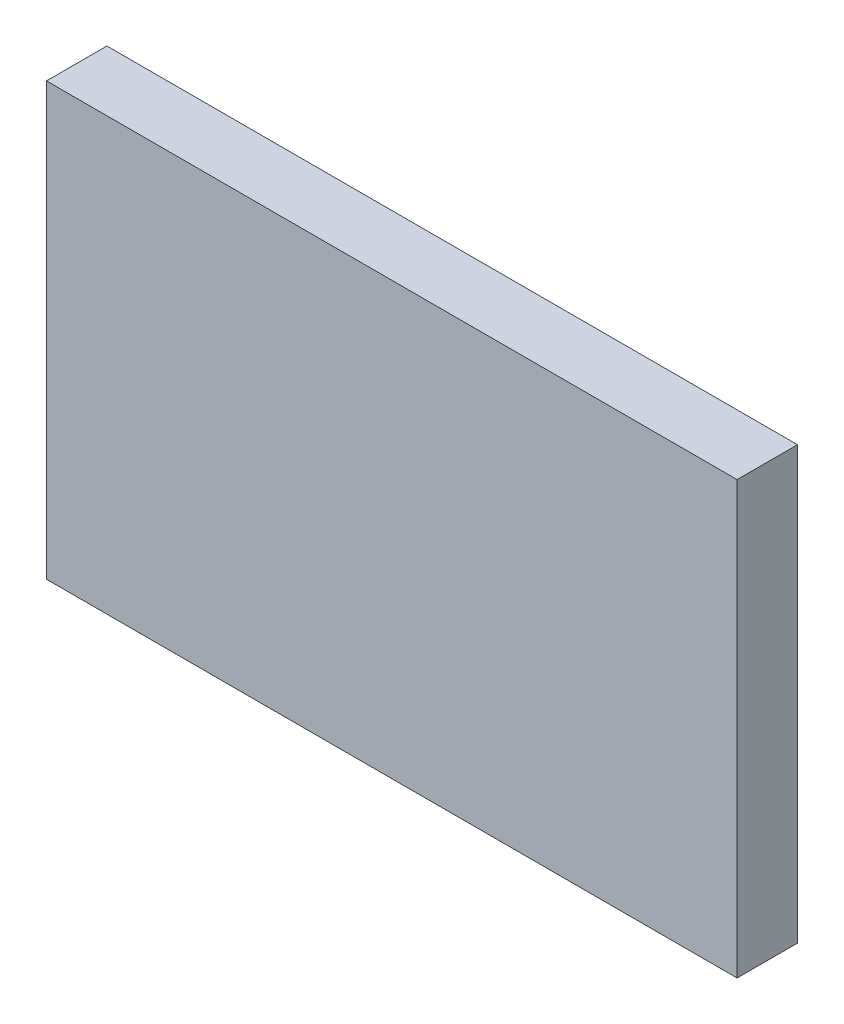
ISO-10303-21;
HEADER;
FILE_DESCRIPTION(('STEP AP214'),'2;1');
FILE_NAME('part.step','',(''),(''),'','','');
FILE_SCHEMA(('AUTOMOTIVE_DESIGN { 1 0 10303 214 1 1 1 1 }'));
ENDSEC;
DATA;
#1=APPLICATION_CONTEXT('core data for automotive mechanical design processes');
#2=APPLICATION_PROTOCOL_DEFINITION('international standard','automotive_design',2000,#1);
#3=PRODUCT_CONTEXT('',#1,'mechanical');
#4=PRODUCT('Part','Part','',(#3));
#5=PRODUCT_RELATED_PRODUCT_CATEGORY('part','',(#4));
#6=PRODUCT_DEFINITION_FORMATION('','',#4);
#7=PRODUCT_DEFINITION_CONTEXT('part definition',#1,'design');
#8=PRODUCT_DEFINITION('design','',#6,#7);
#9=PRODUCT_DEFINITION_SHAPE('','',#8);
#10=(LENGTH_UNIT() NAMED_UNIT(*) SI_UNIT(.MILLI.,.METRE.));
#11=(NAMED_UNIT(*) PLANE_ANGLE_UNIT() SI_UNIT($,.RADIAN.));
#12=(NAMED_UNIT(*) SI_UNIT($,.STERADIAN.) SOLID_ANGLE_UNIT());
#13=UNCERTAINTY_MEASURE_WITH_UNIT(LENGTH_MEASURE(1.E-05),#10,'distance_accuracy_value','');
#14=(GEOMETRIC_REPRESENTATION_CONTEXT(3) GLOBAL_UNCERTAINTY_ASSIGNED_CONTEXT((#13)) GLOBAL_UNIT_ASSIGNED_CONTEXT((#10,
#11,#12)) REPRESENTATION_CONTEXT('',''));
#15=CARTESIAN_POINT('',(0.,0.,0.));
#16=DIRECTION('',(0.,0.,1.));
#17=DIRECTION('',(1.,0.,0.));
#18=AXIS2_PLACEMENT_3D('',#15,#16,#17);
#19=CARTESIAN_POINT('',(40.,25.,-7.));
#20=DIRECTION('',(1.,0.,0.));
#21=DIRECTION('',(0.,1.,0.));
#22=AXIS2_PLACEMENT_3D('',#19,#20,#21);
#23=PLANE('',#22);
#24=DIRECTION('',(0.,1.,0.));
#25=VECTOR('',#24,1.);
#26=CARTESIAN_POINT('',(40.,25.,0.));
#27=LINE('',#26,#25);
#28=CARTESIAN_POINT('',(40.,-25.,0.));
#29=VERTEX_POINT('',#28);
#30=CARTESIAN_POINT('',(40.,25.,0.));
#31=VERTEX_POINT('',#30);
#32=EDGE_CURVE('E147',#29,#31,#27,.T.);
#33=ORIENTED_EDGE('',*,*,#32,.F.);
#34=DIRECTION('',(0.,0.,1.));
#35=VECTOR('',#34,1.);
#36=CARTESIAN_POINT('',(40.,-25.,-7.));
#37=LINE('',#36,#35);
#38=CARTESIAN_POINT('',(40.,-25.,-7.));
#39=VERTEX_POINT('',#38);
#40=EDGE_CURVE('E12',#39,#29,#37,.T.);
#41=ORIENTED_EDGE('',*,*,#40,.F.);
#42=DIRECTION('',(0.,1.,0.));
#43=VECTOR('',#42,1.);
#44=CARTESIAN_POINT('',(40.,25.,-7.));
#45=LINE('',#44,#43);
#46=CARTESIAN_POINT('',(40.,25.,-7.));
#47=VERTEX_POINT('',#46);
#48=EDGE_CURVE('E148',#39,#47,#45,.T.);
#49=ORIENTED_EDGE('',*,*,#48,.T.);
#50=DIRECTION('',(0.,0.,1.));
#51=VECTOR('',#50,1.);
#52=CARTESIAN_POINT('',(40.,25.,-7.));
#53=LINE('',#52,#51);
#54=EDGE_CURVE('E40',#47,#31,#53,.T.);
#55=ORIENTED_EDGE('',*,*,#54,.T.);
#56=EDGE_LOOP('',(#33,#41,#49,#55));
#57=FACE_BOUND('',#56,.T.);
#58=ADVANCED_FACE('F37',(#57),#23,.T.);
#59=CARTESIAN_POINT('',(-40.,-25.,-7.));
#60=DIRECTION('',(0.,-1.,0.));
#61=DIRECTION('',(0.,0.,-1.));
#62=AXIS2_PLACEMENT_3D('',#59,#60,#61);
#63=PLANE('',#62);
#64=DIRECTION('',(1.,0.,0.));
#65=VECTOR('',#64,1.);
#66=CARTESIAN_POINT('',(-40.,-25.,0.));
#67=LINE('',#66,#65);
#68=CARTESIAN_POINT('',(-40.,-25.,0.));
#69=VERTEX_POINT('',#68);
#70=EDGE_CURVE('E151',#69,#29,#67,.T.);
#71=ORIENTED_EDGE('',*,*,#70,.F.);
#72=DIRECTION('',(0.,0.,1.));
#73=VECTOR('',#72,1.);
#74=CARTESIAN_POINT('',(-40.,-25.,-7.));
#75=LINE('',#74,#73);
#76=CARTESIAN_POINT('',(-40.,-25.,-7.));
#77=VERTEX_POINT('',#76);
#78=EDGE_CURVE('E45',#77,#69,#75,.T.);
#79=ORIENTED_EDGE('',*,*,#78,.F.);
#80=DIRECTION('',(1.,0.,0.));
#81=VECTOR('',#80,1.);
#82=CARTESIAN_POINT('',(-40.,-25.,-7.));
#83=LINE('',#82,#81);
#84=EDGE_CURVE('E156',#77,#39,#83,.T.);
#85=ORIENTED_EDGE('',*,*,#84,.T.);
#86=ORIENTED_EDGE('',*,*,#40,.T.);
#87=EDGE_LOOP('',(#71,#79,#85,#86));
#88=FACE_BOUND('',#87,.T.);
#89=ADVANCED_FACE('F173',(#88),#63,.T.);
#90=CARTESIAN_POINT('',(-40.,25.,-7.));
#91=DIRECTION('',(-1.,0.,0.));
#92=DIRECTION('',(0.,-1.,0.));
#93=AXIS2_PLACEMENT_3D('',#90,#91,#92);
#94=PLANE('',#93);
#95=DIRECTION('',(0.,-1.,0.));
#96=VECTOR('',#95,1.);
#97=CARTESIAN_POINT('',(-40.,25.,0.));
#98=LINE('',#97,#96);
#99=CARTESIAN_POINT('',(-40.,25.,0.));
#100=VERTEX_POINT('',#99);
#101=EDGE_CURVE('E163',#100,#69,#98,.T.);
#102=ORIENTED_EDGE('',*,*,#101,.F.);
#103=DIRECTION('',(0.,0.,1.));
#104=VECTOR('',#103,1.);
#105=CARTESIAN_POINT('',(-40.,25.,-7.));
#106=LINE('',#105,#104);
#107=CARTESIAN_POINT('',(-40.,25.,-7.));
#108=VERTEX_POINT('',#107);
#109=EDGE_CURVE('E168',#108,#100,#106,.T.);
#110=ORIENTED_EDGE('',*,*,#109,.F.);
#111=DIRECTION('',(0.,-1.,0.));
#112=VECTOR('',#111,1.);
#113=CARTESIAN_POINT('',(-40.,25.,-7.));
#114=LINE('',#113,#112);
#115=EDGE_CURVE('E153',#108,#77,#114,.T.);
#116=ORIENTED_EDGE('',*,*,#115,.T.);
#117=ORIENTED_EDGE('',*,*,#78,.T.);
#118=EDGE_LOOP('',(#102,#110,#116,#117));
#119=FACE_BOUND('',#118,.T.);
#120=ADVANCED_FACE('F177',(#119),#94,.T.);
#121=CARTESIAN_POINT('',(-40.,25.,-7.));
#122=DIRECTION('',(0.,1.,0.));
#123=DIRECTION('',(0.,0.,1.));
#124=AXIS2_PLACEMENT_3D('',#121,#122,#123);
#125=PLANE('',#124);
#126=DIRECTION('',(-1.,0.,0.));
#127=VECTOR('',#126,1.);
#128=CARTESIAN_POINT('',(-40.,25.,0.));
#129=LINE('',#128,#127);
#130=EDGE_CURVE('E160',#31,#100,#129,.T.);
#131=ORIENTED_EDGE('',*,*,#130,.F.);
#132=ORIENTED_EDGE('',*,*,#54,.F.);
#133=DIRECTION('',(-1.,0.,0.));
#134=VECTOR('',#133,1.);
#135=CARTESIAN_POINT('',(-40.,25.,-7.));
#136=LINE('',#135,#134);
#137=EDGE_CURVE('E150',#47,#108,#136,.T.);
#138=ORIENTED_EDGE('',*,*,#137,.T.);
#139=ORIENTED_EDGE('',*,*,#109,.T.);
#140=EDGE_LOOP('',(#131,#132,#138,#139));
#141=FACE_BOUND('',#140,.T.);
#142=ADVANCED_FACE('F170',(#141),#125,.T.);
#143=CARTESIAN_POINT('',(0.,0.,-7.));
#144=DIRECTION('',(0.,0.,1.));
#145=DIRECTION('',(1.,0.,0.));
#146=AXIS2_PLACEMENT_3D('',#143,#144,#145);
#147=PLANE('',#146);
#148=CARTESIAN_POINT('',(-30.,0.,-7.));
#149=DIRECTION('',(0.,0.,-1.));
#150=DIRECTION('',(-1.,0.,0.));
#151=AXIS2_PLACEMENT_3D('',#148,#149,#150);
#152=CIRCLE('',#151,4.);
#153=CARTESIAN_POINT('',(-30.,-4.,-7.));
#154=VERTEX_POINT('',#153);
#155=CARTESIAN_POINT('',(-30.,4.,-7.));
#156=VERTEX_POINT('',#155);
#157=EDGE_CURVE('E133',#154,#156,#152,.T.);
#158=ORIENTED_EDGE('',*,*,#157,.F.);
#159=DIRECTION('',(-1.,0.,0.));
#160=VECTOR('',#159,1.);
#161=CARTESIAN_POINT('',(30.,-4.,-7.));
#162=LINE('',#161,#160);
#163=CARTESIAN_POINT('',(30.,-4.,-7.));
#164=VERTEX_POINT('',#163);
#165=EDGE_CURVE('E126',#164,#154,#162,.T.);
#166=ORIENTED_EDGE('',*,*,#165,.F.);
#167=CARTESIAN_POINT('',(30.,0.,-7.));
#168=DIRECTION('',(0.,0.,-1.));
#169=DIRECTION('',(-1.,0.,0.));
#170=AXIS2_PLACEMENT_3D('',#167,#168,#169);
#171=CIRCLE('',#170,4.);
#172=CARTESIAN_POINT('',(30.,4.,-7.00000000000001));
#173=VERTEX_POINT('',#172);
#174=EDGE_CURVE('E137',#173,#164,#171,.T.);
#175=ORIENTED_EDGE('',*,*,#174,.F.);
#176=DIRECTION('',(1.,0.,0.));
#177=VECTOR('',#176,1.);
#178=CARTESIAN_POINT('',(30.,4.,-7.));
#179=LINE('',#178,#177);
#180=EDGE_CURVE('E53',#156,#173,#179,.T.);
#181=ORIENTED_EDGE('',*,*,#180,.F.);
#182=EDGE_LOOP('',(#158,#166,#175,#181));
#183=FACE_BOUND('',#182,.T.);
#184=ORIENTED_EDGE('',*,*,#48,.F.);
#185=ORIENTED_EDGE('',*,*,#84,.F.);
#186=ORIENTED_EDGE('',*,*,#115,.F.);
#187=ORIENTED_EDGE('',*,*,#137,.F.);
#188=EDGE_LOOP('',(#184,#185,#186,#187));
#189=FACE_BOUND('',#188,.T.);
#190=ADVANCED_FACE('F179',(#183,#189),#147,.F.);
#191=CARTESIAN_POINT('',(0.,0.,0.));
#192=DIRECTION('',(0.,0.,1.));
#193=DIRECTION('',(1.,0.,0.));
#194=AXIS2_PLACEMENT_3D('',#191,#192,#193);
#195=PLANE('',#194);
#196=ORIENTED_EDGE('',*,*,#32,.T.);
#197=ORIENTED_EDGE('',*,*,#130,.T.);
#198=ORIENTED_EDGE('',*,*,#101,.T.);
#199=ORIENTED_EDGE('',*,*,#70,.T.);
#200=EDGE_LOOP('',(#196,#197,#198,#199));
#201=FACE_BOUND('',#200,.T.);
#202=ADVANCED_FACE('F172',(#201),#195,.T.);
#203=CARTESIAN_POINT('',(0.,0.,-3.));
#204=DIRECTION('',(0.,0.,1.));
#205=DIRECTION('',(1.,0.,0.));
#206=AXIS2_PLACEMENT_3D('',#203,#204,#205);
#207=PLANE('',#206);
#208=CARTESIAN_POINT('',(30.,0.,-3.));
#209=DIRECTION('',(0.,0.,1.));
#210=DIRECTION('',(1.,0.,0.));
#211=AXIS2_PLACEMENT_3D('',#208,#209,#210);
#212=CIRCLE('',#211,4.);
#213=CARTESIAN_POINT('',(30.,4.,-3.));
#214=VERTEX_POINT('',#213);
#215=CARTESIAN_POINT('',(30.,-4.,-3.));
#216=VERTEX_POINT('',#215);
#217=EDGE_CURVE('E130',#214,#216,#212,.F.);
#218=ORIENTED_EDGE('',*,*,#217,.T.);
#219=DIRECTION('',(-1.,0.,0.));
#220=VECTOR('',#219,1.);
#221=CARTESIAN_POINT('',(30.,-4.,-3.));
#222=LINE('',#221,#220);
#223=CARTESIAN_POINT('',(-30.,-4.,-3.));
#224=VERTEX_POINT('',#223);
#225=EDGE_CURVE('E123',#216,#224,#222,.T.);
#226=ORIENTED_EDGE('',*,*,#225,.T.);
#227=CARTESIAN_POINT('',(-30.,0.,-3.));
#228=DIRECTION('',(0.,0.,1.));
#229=DIRECTION('',(1.,0.,0.));
#230=AXIS2_PLACEMENT_3D('',#227,#228,#229);
#231=CIRCLE('',#230,4.);
#232=CARTESIAN_POINT('',(-30.,4.,-3.));
#233=VERTEX_POINT('',#232);
#234=EDGE_CURVE('E110',#224,#233,#231,.F.);
#235=ORIENTED_EDGE('',*,*,#234,.T.);
#236=DIRECTION('',(1.,0.,0.));
#237=VECTOR('',#236,1.);
#238=CARTESIAN_POINT('',(30.,4.,-3.));
#239=LINE('',#238,#237);
#240=EDGE_CURVE('E142',#233,#214,#239,.T.);
#241=ORIENTED_EDGE('',*,*,#240,.T.);
#242=EDGE_LOOP('',(#218,#226,#235,#241));
#243=FACE_BOUND('',#242,.T.);
#244=ADVANCED_FACE('F129',(#243),#207,.F.);
#245=CARTESIAN_POINT('',(30.,-4.,68.4689710744948));
#246=DIRECTION('',(0.,-1.,0.));
#247=DIRECTION('',(0.,0.,-1.));
#248=AXIS2_PLACEMENT_3D('',#245,#246,#247);
#249=PLANE('',#248);
#250=DIRECTION('',(0.,0.,-1.));
#251=VECTOR('',#250,1.);
#252=CARTESIAN_POINT('',(30.,-4.,68.4689710744948));
#253=LINE('',#252,#251);
#254=EDGE_CURVE('E140',#216,#164,#253,.T.);
#255=ORIENTED_EDGE('',*,*,#254,.T.);
#256=ORIENTED_EDGE('',*,*,#165,.T.);
#257=DIRECTION('',(0.,0.,-1.));
#258=VECTOR('',#257,1.);
#259=CARTESIAN_POINT('',(-30.,-4.,68.4689710744948));
#260=LINE('',#259,#258);
#261=EDGE_CURVE('E114',#224,#154,#260,.T.);
#262=ORIENTED_EDGE('',*,*,#261,.F.);
#263=ORIENTED_EDGE('',*,*,#225,.F.);
#264=EDGE_LOOP('',(#255,#256,#262,#263));
#265=FACE_BOUND('',#264,.T.);
#266=ADVANCED_FACE('F122',(#265),#249,.F.);
#267=CARTESIAN_POINT('',(-30.,0.,68.4689710744948));
#268=DIRECTION('',(0.,0.,-1.));
#269=DIRECTION('',(-1.,0.,0.));
#270=AXIS2_PLACEMENT_3D('',#267,#268,#269);
#271=CYLINDRICAL_SURFACE('',#270,4.);
#272=ORIENTED_EDGE('',*,*,#261,.T.);
#273=ORIENTED_EDGE('',*,*,#157,.T.);
#274=DIRECTION('',(0.,0.,-1.));
#275=VECTOR('',#274,1.);
#276=CARTESIAN_POINT('',(-30.,4.,68.4689710744948));
#277=LINE('',#276,#275);
#278=EDGE_CURVE('E116',#233,#156,#277,.T.);
#279=ORIENTED_EDGE('',*,*,#278,.F.);
#280=ORIENTED_EDGE('',*,*,#234,.F.);
#281=EDGE_LOOP('',(#272,#273,#279,#280));
#282=FACE_BOUND('',#281,.T.);
#283=ADVANCED_FACE('F112',(#282),#271,.F.);
#284=CARTESIAN_POINT('',(30.,4.,68.4689710744948));
#285=DIRECTION('',(0.,1.,0.));
#286=DIRECTION('',(0.,0.,1.));
#287=AXIS2_PLACEMENT_3D('',#284,#285,#286);
#288=PLANE('',#287);
#289=ORIENTED_EDGE('',*,*,#278,.T.);
#290=ORIENTED_EDGE('',*,*,#180,.T.);
#291=DIRECTION('',(0.,0.,-1.));
#292=VECTOR('',#291,1.);
#293=CARTESIAN_POINT('',(30.,4.,68.4689710744948));
#294=LINE('',#293,#292);
#295=EDGE_CURVE('E141',#214,#173,#294,.T.);
#296=ORIENTED_EDGE('',*,*,#295,.F.);
#297=ORIENTED_EDGE('',*,*,#240,.F.);
#298=EDGE_LOOP('',(#289,#290,#296,#297));
#299=FACE_BOUND('',#298,.T.);
#300=ADVANCED_FACE('F238',(#299),#288,.F.);
#301=CARTESIAN_POINT('',(30.,0.,68.4689710744948));
#302=DIRECTION('',(0.,0.,-1.));
#303=DIRECTION('',(-1.,0.,0.));
#304=AXIS2_PLACEMENT_3D('',#301,#302,#303);
#305=CYLINDRICAL_SURFACE('',#304,4.);
#306=ORIENTED_EDGE('',*,*,#295,.T.);
#307=ORIENTED_EDGE('',*,*,#174,.T.);
#308=ORIENTED_EDGE('',*,*,#254,.F.);
#309=ORIENTED_EDGE('',*,*,#217,.F.);
#310=EDGE_LOOP('',(#306,#307,#308,#309));
#311=FACE_BOUND('',#310,.T.);
#312=ADVANCED_FACE('F247',(#311),#305,.F.);
#313=CLOSED_SHELL('',(#58,#89,#120,#142,#190,#202,#244,#266,#283,#300,#312));
#314=MANIFOLD_SOLID_BREP('B2',#313);
#315=ADVANCED_BREP_SHAPE_REPRESENTATION('',(#18,#314),#14);
#316=SHAPE_DEFINITION_REPRESENTATION(#9,#315);
ENDSEC;
END-ISO-10303-21;
